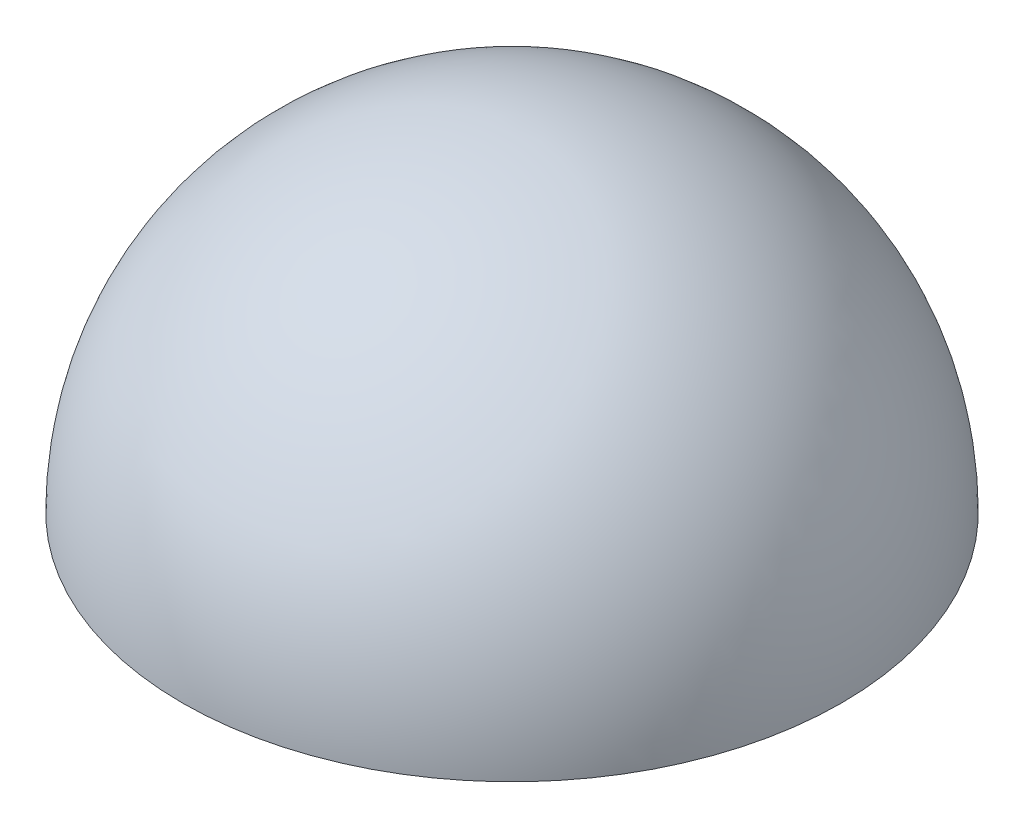
ISO-10303-21;
HEADER;
FILE_DESCRIPTION(('STEP AP214'),'2;1');
FILE_NAME('part.step','',(''),(''),'','','');
FILE_SCHEMA(('AUTOMOTIVE_DESIGN { 1 0 10303 214 1 1 1 1 }'));
ENDSEC;
DATA;
#1=APPLICATION_CONTEXT('core data for automotive mechanical design processes');
#2=APPLICATION_PROTOCOL_DEFINITION('international standard','automotive_design',2000,#1);
#3=PRODUCT_CONTEXT('',#1,'mechanical');
#4=PRODUCT('Part','Part','',(#3));
#5=PRODUCT_RELATED_PRODUCT_CATEGORY('part','',(#4));
#6=PRODUCT_DEFINITION_FORMATION('','',#4);
#7=PRODUCT_DEFINITION_CONTEXT('part definition',#1,'design');
#8=PRODUCT_DEFINITION('design','',#6,#7);
#9=PRODUCT_DEFINITION_SHAPE('','',#8);
#10=(LENGTH_UNIT() NAMED_UNIT(*) SI_UNIT(.MILLI.,.METRE.));
#11=(NAMED_UNIT(*) PLANE_ANGLE_UNIT() SI_UNIT($,.RADIAN.));
#12=(NAMED_UNIT(*) SI_UNIT($,.STERADIAN.) SOLID_ANGLE_UNIT());
#13=UNCERTAINTY_MEASURE_WITH_UNIT(LENGTH_MEASURE(1.E-05),#10,'distance_accuracy_value','');
#14=(GEOMETRIC_REPRESENTATION_CONTEXT(3) GLOBAL_UNCERTAINTY_ASSIGNED_CONTEXT((#13)) GLOBAL_UNIT_ASSIGNED_CONTEXT((#10,
#11,#12)) REPRESENTATION_CONTEXT('',''));
#15=CARTESIAN_POINT('',(0.,0.,0.));
#16=DIRECTION('',(0.,0.,1.));
#17=DIRECTION('',(1.,0.,0.));
#18=AXIS2_PLACEMENT_3D('',#15,#16,#17);
#19=CARTESIAN_POINT('',(0.,0.,0.));
#20=DIRECTION('',(0.,-1.,0.));
#21=DIRECTION('',(0.,0.,-1.));
#22=AXIS2_PLACEMENT_3D('',#19,#20,#21);
#23=PLANE('',#22);
#24=CARTESIAN_POINT('',(0.,0.,0.));
#25=DIRECTION('',(0.,1.,0.));
#26=DIRECTION('',(0.,0.,1.));
#27=AXIS2_PLACEMENT_3D('',#24,#25,#26);
#28=CIRCLE('',#27,4.);
#29=CARTESIAN_POINT('',(0.,0.,4.));
#30=VERTEX_POINT('',#29);
#31=EDGE_CURVE('E47',#30,#30,#28,.T.);
#32=ORIENTED_EDGE('',*,*,#31,.T.);
#33=EDGE_LOOP('',(#32));
#34=FACE_BOUND('',#33,.T.);
#35=CARTESIAN_POINT('',(0.,0.,0.));
#36=DIRECTION('',(0.,-1.,0.));
#37=DIRECTION('',(0.,0.,-1.));
#38=AXIS2_PLACEMENT_3D('',#35,#36,#37);
#39=CIRCLE('',#38,60.);
#40=CARTESIAN_POINT('',(0.,0.,-60.));
#41=VERTEX_POINT('',#40);
#42=EDGE_CURVE('E10',#41,#41,#39,.T.);
#43=ORIENTED_EDGE('',*,*,#42,.T.);
#44=EDGE_LOOP('',(#43));
#45=FACE_BOUND('',#44,.T.);
#46=ADVANCED_FACE('F37',(#34,#45),#23,.T.);
#47=CARTESIAN_POINT('',(0.,0.,0.));
#48=DIRECTION('',(0.,-1.,0.));
#49=DIRECTION('',(1.,0.,0.));
#50=AXIS2_PLACEMENT_3D('',#47,#48,#49);
#51=SPHERICAL_SURFACE('',#50,60.);
#52=ORIENTED_EDGE('',*,*,#42,.F.);
#53=EDGE_LOOP('',(#52));
#54=FACE_BOUND('',#53,.T.);
#55=ADVANCED_FACE('F58',(#54),#51,.T.);
#56=CARTESIAN_POINT('',(0.,14.,0.));
#57=DIRECTION('',(0.,-1.,0.));
#58=DIRECTION('',(0.,0.,-1.));
#59=AXIS2_PLACEMENT_3D('',#56,#57,#58);
#60=CYLINDRICAL_SURFACE('',#59,4.);
#61=CARTESIAN_POINT('',(0.,14.,0.));
#62=DIRECTION('',(0.,1.,0.));
#63=DIRECTION('',(0.,0.,1.));
#64=AXIS2_PLACEMENT_3D('',#61,#62,#63);
#65=CIRCLE('',#64,4.);
#66=CARTESIAN_POINT('',(0.,14.,4.));
#67=VERTEX_POINT('',#66);
#68=EDGE_CURVE('E43',#67,#67,#65,.T.);
#69=ORIENTED_EDGE('',*,*,#68,.T.);
#70=EDGE_LOOP('',(#69));
#71=FACE_BOUND('',#70,.T.);
#72=ORIENTED_EDGE('',*,*,#31,.F.);
#73=EDGE_LOOP('',(#72));
#74=FACE_BOUND('',#73,.T.);
#75=ADVANCED_FACE('F55',(#71,#74),#60,.F.);
#76=CARTESIAN_POINT('',(0.,14.,0.));
#77=DIRECTION('',(0.,1.,0.));
#78=DIRECTION('',(0.,0.,1.));
#79=AXIS2_PLACEMENT_3D('',#76,#77,#78);
#80=PLANE('',#79);
#81=ORIENTED_EDGE('',*,*,#68,.F.);
#82=EDGE_LOOP('',(#81));
#83=FACE_BOUND('',#82,.T.);
#84=ADVANCED_FACE('F57',(#83),#80,.F.);
#85=CLOSED_SHELL('',(#46,#55,#75,#84));
#86=MANIFOLD_SOLID_BREP('B2',#85);
#87=ADVANCED_BREP_SHAPE_REPRESENTATION('',(#18,#86),#14);
#88=SHAPE_DEFINITION_REPRESENTATION(#9,#87);
ENDSEC;
END-ISO-10303-21;
